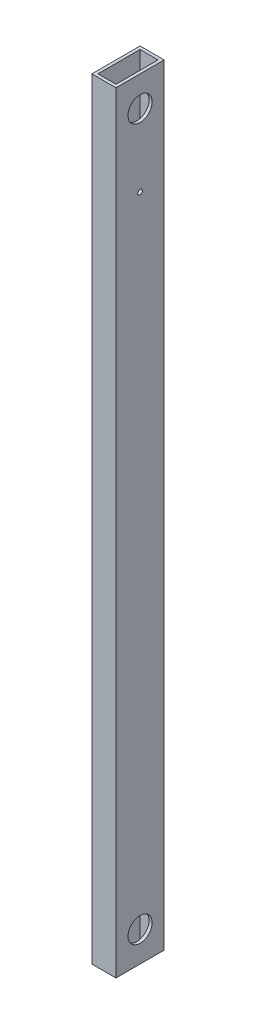
ISO-10303-21;
HEADER;
FILE_DESCRIPTION(('STEP AP214'),'2;1');
FILE_NAME('part.step','',(''),(''),'','','');
FILE_SCHEMA(('AUTOMOTIVE_DESIGN { 1 0 10303 214 1 1 1 1 }'));
ENDSEC;
DATA;
#1=APPLICATION_CONTEXT('core data for automotive mechanical design processes');
#2=APPLICATION_PROTOCOL_DEFINITION('international standard','automotive_design',2000,#1);
#3=PRODUCT_CONTEXT('',#1,'mechanical');
#4=PRODUCT('Part','Part','',(#3));
#5=PRODUCT_RELATED_PRODUCT_CATEGORY('part','',(#4));
#6=PRODUCT_DEFINITION_FORMATION('','',#4);
#7=PRODUCT_DEFINITION_CONTEXT('part definition',#1,'design');
#8=PRODUCT_DEFINITION('design','',#6,#7);
#9=PRODUCT_DEFINITION_SHAPE('','',#8);
#10=(LENGTH_UNIT() NAMED_UNIT(*) SI_UNIT(.MILLI.,.METRE.));
#11=(NAMED_UNIT(*) PLANE_ANGLE_UNIT() SI_UNIT($,.RADIAN.));
#12=(NAMED_UNIT(*) SI_UNIT($,.STERADIAN.) SOLID_ANGLE_UNIT());
#13=UNCERTAINTY_MEASURE_WITH_UNIT(LENGTH_MEASURE(1.E-05),#10,'distance_accuracy_value','');
#14=(GEOMETRIC_REPRESENTATION_CONTEXT(3) GLOBAL_UNCERTAINTY_ASSIGNED_CONTEXT((#13)) GLOBAL_UNIT_ASSIGNED_CONTEXT((#10,
#11,#12)) REPRESENTATION_CONTEXT('',''));
#15=CARTESIAN_POINT('',(0.,0.,0.));
#16=DIRECTION('',(0.,0.,1.));
#17=DIRECTION('',(1.,0.,0.));
#18=AXIS2_PLACEMENT_3D('',#15,#16,#17);
#19=CARTESIAN_POINT('',(0.,406.4,0.));
#20=DIRECTION('',(0.,-1.,0.));
#21=DIRECTION('',(0.,0.,-1.));
#22=AXIS2_PLACEMENT_3D('',#19,#20,#21);
#23=PLANE('',#22);
#24=DIRECTION('',(0.,0.,1.));
#25=VECTOR('',#24,1.);
#26=CARTESIAN_POINT('',(0.,406.4,0.));
#27=LINE('',#26,#25);
#28=CARTESIAN_POINT('',(0.,406.4,-50.8));
#29=VERTEX_POINT('',#28);
#30=CARTESIAN_POINT('',(0.,406.4,0.));
#31=VERTEX_POINT('',#30);
#32=EDGE_CURVE('E133',#29,#31,#27,.T.);
#33=ORIENTED_EDGE('',*,*,#32,.T.);
#34=DIRECTION('',(1.,0.,0.));
#35=VECTOR('',#34,1.);
#36=CARTESIAN_POINT('',(0.,406.4,0.));
#37=LINE('',#36,#35);
#38=CARTESIAN_POINT('',(25.4,406.4,0.));
#39=VERTEX_POINT('',#38);
#40=EDGE_CURVE('E136',#31,#39,#37,.T.);
#41=ORIENTED_EDGE('',*,*,#40,.T.);
#42=DIRECTION('',(0.,0.,-1.));
#43=VECTOR('',#42,1.);
#44=CARTESIAN_POINT('',(25.4,406.4,0.));
#45=LINE('',#44,#43);
#46=CARTESIAN_POINT('',(25.4,406.4,-50.8));
#47=VERTEX_POINT('',#46);
#48=EDGE_CURVE('E139',#39,#47,#45,.T.);
#49=ORIENTED_EDGE('',*,*,#48,.T.);
#50=DIRECTION('',(-1.,0.,0.));
#51=VECTOR('',#50,1.);
#52=CARTESIAN_POINT('',(0.,406.4,-50.8));
#53=LINE('',#52,#51);
#54=EDGE_CURVE('E141',#47,#29,#53,.T.);
#55=ORIENTED_EDGE('',*,*,#54,.T.);
#56=EDGE_LOOP('',(#33,#41,#49,#55));
#57=FACE_BOUND('',#56,.T.);
#58=DIRECTION('',(0.,0.,1.));
#59=VECTOR('',#58,1.);
#60=CARTESIAN_POINT('',(3.175,406.4,0.));
#61=LINE('',#60,#59);
#62=CARTESIAN_POINT('',(3.175,406.4,-47.625));
#63=VERTEX_POINT('',#62);
#64=CARTESIAN_POINT('',(3.175,406.4,-3.175));
#65=VERTEX_POINT('',#64);
#66=EDGE_CURVE('E121',#63,#65,#61,.T.);
#67=ORIENTED_EDGE('',*,*,#66,.F.);
#68=DIRECTION('',(-1.,0.,0.));
#69=VECTOR('',#68,1.);
#70=CARTESIAN_POINT('',(0.,406.4,-47.625));
#71=LINE('',#70,#69);
#72=CARTESIAN_POINT('',(22.225,406.4,-47.625));
#73=VERTEX_POINT('',#72);
#74=EDGE_CURVE('E105',#73,#63,#71,.T.);
#75=ORIENTED_EDGE('',*,*,#74,.F.);
#76=DIRECTION('',(0.,0.,-1.));
#77=VECTOR('',#76,1.);
#78=CARTESIAN_POINT('',(22.225,406.4,0.));
#79=LINE('',#78,#77);
#80=CARTESIAN_POINT('',(22.225,406.4,-3.175));
#81=VERTEX_POINT('',#80);
#82=EDGE_CURVE('E130',#81,#73,#79,.T.);
#83=ORIENTED_EDGE('',*,*,#82,.F.);
#84=DIRECTION('',(1.,0.,0.));
#85=VECTOR('',#84,1.);
#86=CARTESIAN_POINT('',(0.,406.4,-3.175));
#87=LINE('',#86,#85);
#88=EDGE_CURVE('E123',#65,#81,#87,.T.);
#89=ORIENTED_EDGE('',*,*,#88,.F.);
#90=EDGE_LOOP('',(#67,#75,#83,#89));
#91=FACE_BOUND('',#90,.T.);
#92=ADVANCED_FACE('F33',(#57,#91),#23,.F.);
#93=CARTESIAN_POINT('',(0.,-406.4,0.));
#94=DIRECTION('',(0.,-1.,0.));
#95=DIRECTION('',(0.,0.,-1.));
#96=AXIS2_PLACEMENT_3D('',#93,#94,#95);
#97=PLANE('',#96);
#98=DIRECTION('',(0.,0.,1.));
#99=VECTOR('',#98,1.);
#100=CARTESIAN_POINT('',(0.,-406.4,0.));
#101=LINE('',#100,#99);
#102=CARTESIAN_POINT('',(0.,-406.4,-50.8));
#103=VERTEX_POINT('',#102);
#104=CARTESIAN_POINT('',(0.,-406.4,0.));
#105=VERTEX_POINT('',#104);
#106=EDGE_CURVE('E144',#103,#105,#101,.T.);
#107=ORIENTED_EDGE('',*,*,#106,.F.);
#108=DIRECTION('',(-1.,0.,0.));
#109=VECTOR('',#108,1.);
#110=CARTESIAN_POINT('',(0.,-406.4,-50.8));
#111=LINE('',#110,#109);
#112=CARTESIAN_POINT('',(25.4,-406.4,-50.8));
#113=VERTEX_POINT('',#112);
#114=EDGE_CURVE('E137',#113,#103,#111,.T.);
#115=ORIENTED_EDGE('',*,*,#114,.F.);
#116=DIRECTION('',(0.,0.,-1.));
#117=VECTOR('',#116,1.);
#118=CARTESIAN_POINT('',(25.4,-406.4,0.));
#119=LINE('',#118,#117);
#120=CARTESIAN_POINT('',(25.4,-406.4,0.));
#121=VERTEX_POINT('',#120);
#122=EDGE_CURVE('E149',#121,#113,#119,.T.);
#123=ORIENTED_EDGE('',*,*,#122,.F.);
#124=DIRECTION('',(1.,0.,0.));
#125=VECTOR('',#124,1.);
#126=CARTESIAN_POINT('',(0.,-406.4,0.));
#127=LINE('',#126,#125);
#128=EDGE_CURVE('E147',#105,#121,#127,.T.);
#129=ORIENTED_EDGE('',*,*,#128,.F.);
#130=EDGE_LOOP('',(#107,#115,#123,#129));
#131=FACE_BOUND('',#130,.T.);
#132=DIRECTION('',(-1.,0.,0.));
#133=VECTOR('',#132,1.);
#134=CARTESIAN_POINT('',(0.,-406.4,-47.625));
#135=LINE('',#134,#133);
#136=CARTESIAN_POINT('',(22.225,-406.4,-47.625));
#137=VERTEX_POINT('',#136);
#138=CARTESIAN_POINT('',(3.175,-406.4,-47.625));
#139=VERTEX_POINT('',#138);
#140=EDGE_CURVE('E103',#137,#139,#135,.T.);
#141=ORIENTED_EDGE('',*,*,#140,.T.);
#142=DIRECTION('',(0.,0.,1.));
#143=VECTOR('',#142,1.);
#144=CARTESIAN_POINT('',(3.175,-406.4,0.));
#145=LINE('',#144,#143);
#146=CARTESIAN_POINT('',(3.175,-406.4,-3.175));
#147=VERTEX_POINT('',#146);
#148=EDGE_CURVE('E111',#139,#147,#145,.T.);
#149=ORIENTED_EDGE('',*,*,#148,.T.);
#150=DIRECTION('',(1.,0.,0.));
#151=VECTOR('',#150,1.);
#152=CARTESIAN_POINT('',(0.,-406.4,-3.175));
#153=LINE('',#152,#151);
#154=CARTESIAN_POINT('',(22.225,-406.4,-3.175));
#155=VERTEX_POINT('',#154);
#156=EDGE_CURVE('E117',#147,#155,#153,.T.);
#157=ORIENTED_EDGE('',*,*,#156,.T.);
#158=DIRECTION('',(0.,0.,-1.));
#159=VECTOR('',#158,1.);
#160=CARTESIAN_POINT('',(22.225,-406.4,0.));
#161=LINE('',#160,#159);
#162=EDGE_CURVE('E57',#155,#137,#161,.T.);
#163=ORIENTED_EDGE('',*,*,#162,.T.);
#164=EDGE_LOOP('',(#141,#149,#157,#163));
#165=FACE_BOUND('',#164,.T.);
#166=ADVANCED_FACE('F120',(#131,#165),#97,.T.);
#167=CARTESIAN_POINT('',(0.,406.4,0.));
#168=DIRECTION('',(1.,0.,0.));
#169=DIRECTION('',(0.,0.,-1.));
#170=AXIS2_PLACEMENT_3D('',#167,#168,#169);
#171=PLANE('',#170);
#172=CARTESIAN_POINT('',(0.,374.65,-25.4));
#173=DIRECTION('',(1.,0.,0.));
#174=DIRECTION('',(0.,0.,-1.));
#175=AXIS2_PLACEMENT_3D('',#172,#173,#174);
#176=CIRCLE('',#175,12.7);
#177=CARTESIAN_POINT('',(0.,374.65,-38.1));
#178=VERTEX_POINT('',#177);
#179=EDGE_CURVE('E162',#178,#178,#176,.T.);
#180=ORIENTED_EDGE('',*,*,#179,.T.);
#181=EDGE_LOOP('',(#180));
#182=FACE_BOUND('',#181,.T.);
#183=CARTESIAN_POINT('',(0.,-374.65,-25.4));
#184=DIRECTION('',(1.,0.,0.));
#185=DIRECTION('',(0.,0.,-1.));
#186=AXIS2_PLACEMENT_3D('',#183,#184,#185);
#187=CIRCLE('',#186,12.7);
#188=CARTESIAN_POINT('',(0.,-374.65,-38.1));
#189=VERTEX_POINT('',#188);
#190=EDGE_CURVE('E242',#189,#189,#187,.T.);
#191=ORIENTED_EDGE('',*,*,#190,.T.);
#192=EDGE_LOOP('',(#191));
#193=FACE_BOUND('',#192,.T.);
#194=CARTESIAN_POINT('',(0.,298.45,-25.4));
#195=DIRECTION('',(1.,0.,0.));
#196=DIRECTION('',(0.,0.,-1.));
#197=AXIS2_PLACEMENT_3D('',#194,#195,#196);
#198=CIRCLE('',#197,2.48920000000001);
#199=CARTESIAN_POINT('',(0.,298.45,-27.8892));
#200=VERTEX_POINT('',#199);
#201=EDGE_CURVE('E245',#200,#200,#198,.T.);
#202=ORIENTED_EDGE('',*,*,#201,.T.);
#203=EDGE_LOOP('',(#202));
#204=FACE_BOUND('',#203,.T.);
#205=ORIENTED_EDGE('',*,*,#106,.T.);
#206=DIRECTION('',(0.,-1.,0.));
#207=VECTOR('',#206,1.);
#208=CARTESIAN_POINT('',(0.,406.4,0.));
#209=LINE('',#208,#207);
#210=EDGE_CURVE('E11',#31,#105,#209,.T.);
#211=ORIENTED_EDGE('',*,*,#210,.F.);
#212=ORIENTED_EDGE('',*,*,#32,.F.);
#213=DIRECTION('',(0.,-1.,0.));
#214=VECTOR('',#213,1.);
#215=CARTESIAN_POINT('',(0.,406.4,-50.8));
#216=LINE('',#215,#214);
#217=EDGE_CURVE('E143',#29,#103,#216,.T.);
#218=ORIENTED_EDGE('',*,*,#217,.T.);
#219=EDGE_LOOP('',(#205,#211,#212,#218));
#220=FACE_BOUND('',#219,.T.);
#221=ADVANCED_FACE('F35',(#182,#193,#204,#220),#171,.F.);
#222=CARTESIAN_POINT('',(0.,406.4,0.));
#223=DIRECTION('',(0.,0.,-1.));
#224=DIRECTION('',(-1.,0.,0.));
#225=AXIS2_PLACEMENT_3D('',#222,#223,#224);
#226=PLANE('',#225);
#227=ORIENTED_EDGE('',*,*,#128,.T.);
#228=DIRECTION('',(0.,-1.,0.));
#229=VECTOR('',#228,1.);
#230=CARTESIAN_POINT('',(25.4,406.4,0.));
#231=LINE('',#230,#229);
#232=EDGE_CURVE('E42',#39,#121,#231,.T.);
#233=ORIENTED_EDGE('',*,*,#232,.F.);
#234=ORIENTED_EDGE('',*,*,#40,.F.);
#235=ORIENTED_EDGE('',*,*,#210,.T.);
#236=EDGE_LOOP('',(#227,#233,#234,#235));
#237=FACE_BOUND('',#236,.T.);
#238=ADVANCED_FACE('F214',(#237),#226,.F.);
#239=CARTESIAN_POINT('',(25.4,406.4,0.));
#240=DIRECTION('',(-1.,0.,0.));
#241=DIRECTION('',(0.,0.,1.));
#242=AXIS2_PLACEMENT_3D('',#239,#240,#241);
#243=PLANE('',#242);
#244=CARTESIAN_POINT('',(25.4,374.65,-25.4));
#245=DIRECTION('',(1.,0.,0.));
#246=DIRECTION('',(0.,0.,-1.));
#247=AXIS2_PLACEMENT_3D('',#244,#245,#246);
#248=CIRCLE('',#247,12.7);
#249=CARTESIAN_POINT('',(25.4,374.65,-38.1));
#250=VERTEX_POINT('',#249);
#251=EDGE_CURVE('E253',#250,#250,#248,.T.);
#252=ORIENTED_EDGE('',*,*,#251,.F.);
#253=EDGE_LOOP('',(#252));
#254=FACE_BOUND('',#253,.T.);
#255=CARTESIAN_POINT('',(25.4,-374.65,-25.4));
#256=DIRECTION('',(1.,0.,0.));
#257=DIRECTION('',(0.,0.,-1.));
#258=AXIS2_PLACEMENT_3D('',#255,#256,#257);
#259=CIRCLE('',#258,12.7);
#260=CARTESIAN_POINT('',(25.4,-374.65,-38.1));
#261=VERTEX_POINT('',#260);
#262=EDGE_CURVE('E247',#261,#261,#259,.T.);
#263=ORIENTED_EDGE('',*,*,#262,.F.);
#264=EDGE_LOOP('',(#263));
#265=FACE_BOUND('',#264,.T.);
#266=CARTESIAN_POINT('',(25.4,298.45,-25.4));
#267=DIRECTION('',(1.,0.,0.));
#268=DIRECTION('',(0.,0.,-1.));
#269=AXIS2_PLACEMENT_3D('',#266,#267,#268);
#270=CIRCLE('',#269,2.48920000000001);
#271=CARTESIAN_POINT('',(25.4,298.45,-27.8892));
#272=VERTEX_POINT('',#271);
#273=EDGE_CURVE('E175',#272,#272,#270,.T.);
#274=ORIENTED_EDGE('',*,*,#273,.F.);
#275=EDGE_LOOP('',(#274));
#276=FACE_BOUND('',#275,.T.);
#277=ORIENTED_EDGE('',*,*,#122,.T.);
#278=DIRECTION('',(0.,-1.,0.));
#279=VECTOR('',#278,1.);
#280=CARTESIAN_POINT('',(25.4,406.4,-50.8));
#281=LINE('',#280,#279);
#282=EDGE_CURVE('E154',#47,#113,#281,.T.);
#283=ORIENTED_EDGE('',*,*,#282,.F.);
#284=ORIENTED_EDGE('',*,*,#48,.F.);
#285=ORIENTED_EDGE('',*,*,#232,.T.);
#286=EDGE_LOOP('',(#277,#283,#284,#285));
#287=FACE_BOUND('',#286,.T.);
#288=ADVANCED_FACE('F211',(#254,#265,#276,#287),#243,.F.);
#289=CARTESIAN_POINT('',(0.,406.4,-50.8));
#290=DIRECTION('',(0.,0.,1.));
#291=DIRECTION('',(1.,0.,0.));
#292=AXIS2_PLACEMENT_3D('',#289,#290,#291);
#293=PLANE('',#292);
#294=ORIENTED_EDGE('',*,*,#114,.T.);
#295=ORIENTED_EDGE('',*,*,#217,.F.);
#296=ORIENTED_EDGE('',*,*,#54,.F.);
#297=ORIENTED_EDGE('',*,*,#282,.T.);
#298=EDGE_LOOP('',(#294,#295,#296,#297));
#299=FACE_BOUND('',#298,.T.);
#300=ADVANCED_FACE('F196',(#299),#293,.F.);
#301=CARTESIAN_POINT('',(3.175,406.4,0.));
#302=DIRECTION('',(1.,0.,0.));
#303=DIRECTION('',(0.,0.,-1.));
#304=AXIS2_PLACEMENT_3D('',#301,#302,#303);
#305=PLANE('',#304);
#306=CARTESIAN_POINT('',(3.175,374.65,-25.4));
#307=DIRECTION('',(1.,0.,0.));
#308=DIRECTION('',(0.,0.,-1.));
#309=AXIS2_PLACEMENT_3D('',#306,#307,#308);
#310=CIRCLE('',#309,12.7);
#311=CARTESIAN_POINT('',(3.175,374.65,-38.1));
#312=VERTEX_POINT('',#311);
#313=EDGE_CURVE('E118',#312,#312,#310,.T.);
#314=ORIENTED_EDGE('',*,*,#313,.F.);
#315=EDGE_LOOP('',(#314));
#316=FACE_BOUND('',#315,.T.);
#317=CARTESIAN_POINT('',(3.175,-374.65,-25.4));
#318=DIRECTION('',(1.,0.,0.));
#319=DIRECTION('',(0.,0.,-1.));
#320=AXIS2_PLACEMENT_3D('',#317,#318,#319);
#321=CIRCLE('',#320,12.7);
#322=CARTESIAN_POINT('',(3.175,-374.65,-38.1));
#323=VERTEX_POINT('',#322);
#324=EDGE_CURVE('E165',#323,#323,#321,.T.);
#325=ORIENTED_EDGE('',*,*,#324,.F.);
#326=EDGE_LOOP('',(#325));
#327=FACE_BOUND('',#326,.T.);
#328=CARTESIAN_POINT('',(3.175,298.45,-25.4));
#329=DIRECTION('',(1.,0.,0.));
#330=DIRECTION('',(0.,0.,-1.));
#331=AXIS2_PLACEMENT_3D('',#328,#329,#330);
#332=CIRCLE('',#331,2.48920000000001);
#333=CARTESIAN_POINT('',(3.175,298.45,-27.8892));
#334=VERTEX_POINT('',#333);
#335=EDGE_CURVE('E161',#334,#334,#332,.T.);
#336=ORIENTED_EDGE('',*,*,#335,.F.);
#337=EDGE_LOOP('',(#336));
#338=FACE_BOUND('',#337,.T.);
#339=ORIENTED_EDGE('',*,*,#148,.F.);
#340=DIRECTION('',(0.,-1.,0.));
#341=VECTOR('',#340,1.);
#342=CARTESIAN_POINT('',(3.175,406.4,-47.625));
#343=LINE('',#342,#341);
#344=EDGE_CURVE('E99',#63,#139,#343,.T.);
#345=ORIENTED_EDGE('',*,*,#344,.F.);
#346=ORIENTED_EDGE('',*,*,#66,.T.);
#347=DIRECTION('',(0.,-1.,0.));
#348=VECTOR('',#347,1.);
#349=CARTESIAN_POINT('',(3.175,406.4,-3.175));
#350=LINE('',#349,#348);
#351=EDGE_CURVE('E114',#65,#147,#350,.T.);
#352=ORIENTED_EDGE('',*,*,#351,.T.);
#353=EDGE_LOOP('',(#339,#345,#346,#352));
#354=FACE_BOUND('',#353,.T.);
#355=ADVANCED_FACE('F112',(#316,#327,#338,#354),#305,.T.);
#356=CARTESIAN_POINT('',(0.,406.4,-3.175));
#357=DIRECTION('',(0.,0.,-1.));
#358=DIRECTION('',(-1.,0.,0.));
#359=AXIS2_PLACEMENT_3D('',#356,#357,#358);
#360=PLANE('',#359);
#361=ORIENTED_EDGE('',*,*,#156,.F.);
#362=ORIENTED_EDGE('',*,*,#351,.F.);
#363=ORIENTED_EDGE('',*,*,#88,.T.);
#364=DIRECTION('',(0.,-1.,0.));
#365=VECTOR('',#364,1.);
#366=CARTESIAN_POINT('',(22.225,406.4,-3.175));
#367=LINE('',#366,#365);
#368=EDGE_CURVE('E180',#81,#155,#367,.T.);
#369=ORIENTED_EDGE('',*,*,#368,.T.);
#370=EDGE_LOOP('',(#361,#362,#363,#369));
#371=FACE_BOUND('',#370,.T.);
#372=ADVANCED_FACE('F187',(#371),#360,.T.);
#373=CARTESIAN_POINT('',(22.225,406.4,0.));
#374=DIRECTION('',(-1.,0.,0.));
#375=DIRECTION('',(0.,0.,1.));
#376=AXIS2_PLACEMENT_3D('',#373,#374,#375);
#377=PLANE('',#376);
#378=CARTESIAN_POINT('',(22.225,374.65,-25.4));
#379=DIRECTION('',(-1.,0.,0.));
#380=DIRECTION('',(0.,0.,1.));
#381=AXIS2_PLACEMENT_3D('',#378,#379,#380);
#382=CIRCLE('',#381,12.7);
#383=CARTESIAN_POINT('',(22.225,374.65,-12.7));
#384=VERTEX_POINT('',#383);
#385=EDGE_CURVE('E37',#384,#384,#382,.T.);
#386=ORIENTED_EDGE('',*,*,#385,.F.);
#387=EDGE_LOOP('',(#386));
#388=FACE_BOUND('',#387,.T.);
#389=CARTESIAN_POINT('',(22.225,-374.65,-25.4));
#390=DIRECTION('',(-1.,0.,0.));
#391=DIRECTION('',(0.,0.,1.));
#392=AXIS2_PLACEMENT_3D('',#389,#390,#391);
#393=CIRCLE('',#392,12.7);
#394=CARTESIAN_POINT('',(22.225,-374.65,-12.7));
#395=VERTEX_POINT('',#394);
#396=EDGE_CURVE('E163',#395,#395,#393,.T.);
#397=ORIENTED_EDGE('',*,*,#396,.F.);
#398=EDGE_LOOP('',(#397));
#399=FACE_BOUND('',#398,.T.);
#400=CARTESIAN_POINT('',(22.225,298.45,-25.4));
#401=DIRECTION('',(-1.,0.,0.));
#402=DIRECTION('',(0.,0.,1.));
#403=AXIS2_PLACEMENT_3D('',#400,#401,#402);
#404=CIRCLE('',#403,2.48920000000001);
#405=CARTESIAN_POINT('',(22.225,298.45,-22.9108));
#406=VERTEX_POINT('',#405);
#407=EDGE_CURVE('E159',#406,#406,#404,.T.);
#408=ORIENTED_EDGE('',*,*,#407,.F.);
#409=EDGE_LOOP('',(#408));
#410=FACE_BOUND('',#409,.T.);
#411=ORIENTED_EDGE('',*,*,#162,.F.);
#412=ORIENTED_EDGE('',*,*,#368,.F.);
#413=ORIENTED_EDGE('',*,*,#82,.T.);
#414=DIRECTION('',(0.,-1.,0.));
#415=VECTOR('',#414,1.);
#416=CARTESIAN_POINT('',(22.225,406.4,-47.625));
#417=LINE('',#416,#415);
#418=EDGE_CURVE('E50',#73,#137,#417,.T.);
#419=ORIENTED_EDGE('',*,*,#418,.T.);
#420=EDGE_LOOP('',(#411,#412,#413,#419));
#421=FACE_BOUND('',#420,.T.);
#422=ADVANCED_FACE('F182',(#388,#399,#410,#421),#377,.T.);
#423=CARTESIAN_POINT('',(0.,406.4,-47.625));
#424=DIRECTION('',(0.,0.,1.));
#425=DIRECTION('',(1.,0.,0.));
#426=AXIS2_PLACEMENT_3D('',#423,#424,#425);
#427=PLANE('',#426);
#428=ORIENTED_EDGE('',*,*,#140,.F.);
#429=ORIENTED_EDGE('',*,*,#418,.F.);
#430=ORIENTED_EDGE('',*,*,#74,.T.);
#431=ORIENTED_EDGE('',*,*,#344,.T.);
#432=EDGE_LOOP('',(#428,#429,#430,#431));
#433=FACE_BOUND('',#432,.T.);
#434=ADVANCED_FACE('F101',(#433),#427,.T.);
#435=CARTESIAN_POINT('',(0.,298.45,-25.4));
#436=DIRECTION('',(1.,0.,0.));
#437=DIRECTION('',(0.,0.,-1.));
#438=AXIS2_PLACEMENT_3D('',#435,#436,#437);
#439=CYLINDRICAL_SURFACE('',#438,2.48920000000001);
#440=ORIENTED_EDGE('',*,*,#407,.T.);
#441=EDGE_LOOP('',(#440));
#442=FACE_BOUND('',#441,.T.);
#443=ORIENTED_EDGE('',*,*,#273,.T.);
#444=EDGE_LOOP('',(#443));
#445=FACE_BOUND('',#444,.T.);
#446=ADVANCED_FACE('F264',(#442,#445),#439,.F.);
#447=CARTESIAN_POINT('',(0.,-374.65,-25.4));
#448=DIRECTION('',(1.,0.,0.));
#449=DIRECTION('',(0.,0.,-1.));
#450=AXIS2_PLACEMENT_3D('',#447,#448,#449);
#451=CYLINDRICAL_SURFACE('',#450,12.7);
#452=ORIENTED_EDGE('',*,*,#396,.T.);
#453=EDGE_LOOP('',(#452));
#454=FACE_BOUND('',#453,.T.);
#455=ORIENTED_EDGE('',*,*,#262,.T.);
#456=EDGE_LOOP('',(#455));
#457=FACE_BOUND('',#456,.T.);
#458=ADVANCED_FACE('F266',(#454,#457),#451,.F.);
#459=CARTESIAN_POINT('',(0.,374.65,-25.4));
#460=DIRECTION('',(1.,0.,0.));
#461=DIRECTION('',(0.,0.,-1.));
#462=AXIS2_PLACEMENT_3D('',#459,#460,#461);
#463=CYLINDRICAL_SURFACE('',#462,12.7);
#464=ORIENTED_EDGE('',*,*,#385,.T.);
#465=EDGE_LOOP('',(#464));
#466=FACE_BOUND('',#465,.T.);
#467=ORIENTED_EDGE('',*,*,#251,.T.);
#468=EDGE_LOOP('',(#467));
#469=FACE_BOUND('',#468,.T.);
#470=ADVANCED_FACE('F258',(#466,#469),#463,.F.);
#471=ORIENTED_EDGE('',*,*,#335,.T.);
#472=EDGE_LOOP('',(#471));
#473=FACE_BOUND('',#472,.T.);
#474=ORIENTED_EDGE('',*,*,#201,.F.);
#475=EDGE_LOOP('',(#474));
#476=FACE_BOUND('',#475,.T.);
#477=ADVANCED_FACE('F269',(#473,#476),#439,.F.);
#478=ORIENTED_EDGE('',*,*,#324,.T.);
#479=EDGE_LOOP('',(#478));
#480=FACE_BOUND('',#479,.T.);
#481=ORIENTED_EDGE('',*,*,#190,.F.);
#482=EDGE_LOOP('',(#481));
#483=FACE_BOUND('',#482,.T.);
#484=ADVANCED_FACE('F275',(#480,#483),#451,.F.);
#485=ORIENTED_EDGE('',*,*,#313,.T.);
#486=EDGE_LOOP('',(#485));
#487=FACE_BOUND('',#486,.T.);
#488=ORIENTED_EDGE('',*,*,#179,.F.);
#489=EDGE_LOOP('',(#488));
#490=FACE_BOUND('',#489,.T.);
#491=ADVANCED_FACE('F281',(#487,#490),#463,.F.);
#492=CLOSED_SHELL('',(#92,#166,#221,#238,#288,#300,#355,#372,#422,#434,#446,#458,#470,#477,#484,#491));
#493=MANIFOLD_SOLID_BREP('B2',#492);
#494=ADVANCED_BREP_SHAPE_REPRESENTATION('',(#18,#493),#14);
#495=SHAPE_DEFINITION_REPRESENTATION(#9,#494);
ENDSEC;
END-ISO-10303-21;
